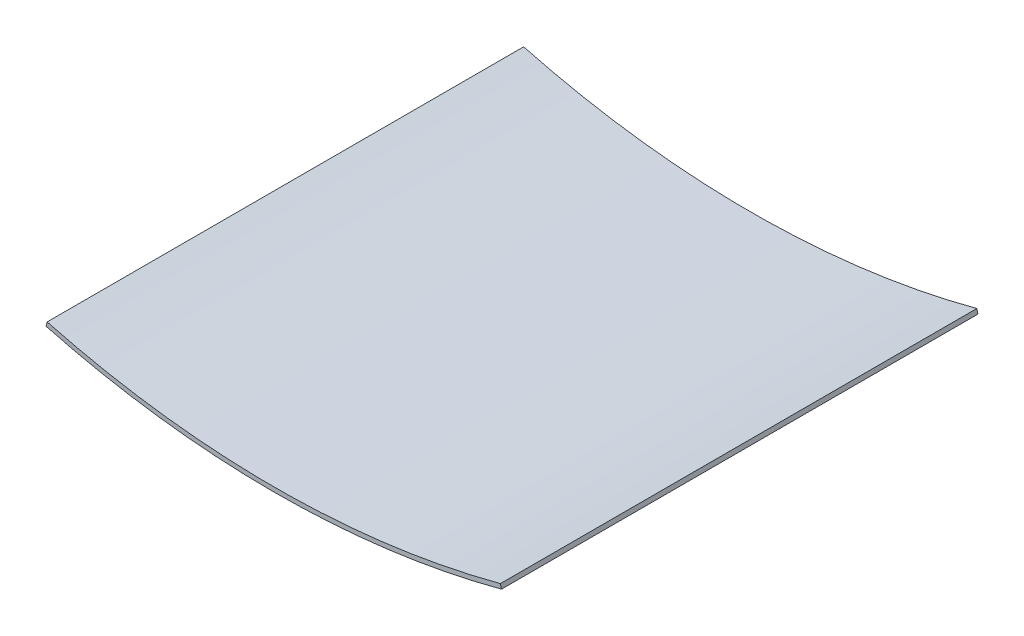
ISO-10303-21;
HEADER;
FILE_DESCRIPTION(('STEP AP214'),'2;1');
FILE_NAME('part.step','',(''),(''),'','','');
FILE_SCHEMA(('AUTOMOTIVE_DESIGN { 1 0 10303 214 1 1 1 1 }'));
ENDSEC;
DATA;
#1=APPLICATION_CONTEXT('core data for automotive mechanical design processes');
#2=APPLICATION_PROTOCOL_DEFINITION('international standard','automotive_design',2000,#1);
#3=PRODUCT_CONTEXT('',#1,'mechanical');
#4=PRODUCT('Part','Part','',(#3));
#5=PRODUCT_RELATED_PRODUCT_CATEGORY('part','',(#4));
#6=PRODUCT_DEFINITION_FORMATION('','',#4);
#7=PRODUCT_DEFINITION_CONTEXT('part definition',#1,'design');
#8=PRODUCT_DEFINITION('design','',#6,#7);
#9=PRODUCT_DEFINITION_SHAPE('','',#8);
#10=(LENGTH_UNIT() NAMED_UNIT(*) SI_UNIT(.MILLI.,.METRE.));
#11=(NAMED_UNIT(*) PLANE_ANGLE_UNIT() SI_UNIT($,.RADIAN.));
#12=(NAMED_UNIT(*) SI_UNIT($,.STERADIAN.) SOLID_ANGLE_UNIT());
#13=UNCERTAINTY_MEASURE_WITH_UNIT(LENGTH_MEASURE(1.E-05),#10,'distance_accuracy_value','');
#14=(GEOMETRIC_REPRESENTATION_CONTEXT(3) GLOBAL_UNCERTAINTY_ASSIGNED_CONTEXT((#13)) GLOBAL_UNIT_ASSIGNED_CONTEXT((#10,
#11,#12)) REPRESENTATION_CONTEXT('',''));
#15=CARTESIAN_POINT('',(0.,0.,0.));
#16=DIRECTION('',(0.,0.,1.));
#17=DIRECTION('',(1.,0.,0.));
#18=AXIS2_PLACEMENT_3D('',#15,#16,#17);
#19=CARTESIAN_POINT('',(0.,761.223622047244,410.));
#20=DIRECTION('',(0.,0.,-1.));
#21=DIRECTION('',(-1.,0.,0.));
#22=AXIS2_PLACEMENT_3D('',#19,#20,#21);
#23=CYLINDRICAL_SURFACE('',#22,765.033622047244);
#24=CARTESIAN_POINT('',(0.,761.223622047244,0.));
#25=DIRECTION('',(0.,0.,1.));
#26=DIRECTION('',(1.,0.,0.));
#27=AXIS2_PLACEMENT_3D('',#24,#25,#26);
#28=CIRCLE('',#27,765.033622047244);
#29=CARTESIAN_POINT('',(-195.97599441016,21.717129528298,0.));
#30=VERTEX_POINT('',#29);
#31=CARTESIAN_POINT('',(195.97599441016,21.7171295282979,0.));
#32=VERTEX_POINT('',#31);
#33=EDGE_CURVE('E96',#30,#32,#28,.T.);
#34=ORIENTED_EDGE('',*,*,#33,.T.);
#35=DIRECTION('',(0.,0.,-1.));
#36=VECTOR('',#35,1.);
#37=CARTESIAN_POINT('',(195.97599441016,21.7171295282979,410.));
#38=LINE('',#37,#36);
#39=CARTESIAN_POINT('',(195.97599441016,21.7171295282979,410.));
#40=VERTEX_POINT('',#39);
#41=EDGE_CURVE('E11',#40,#32,#38,.T.);
#42=ORIENTED_EDGE('',*,*,#41,.F.);
#43=CARTESIAN_POINT('',(0.,761.223622047244,410.));
#44=DIRECTION('',(0.,0.,1.));
#45=DIRECTION('',(1.,0.,0.));
#46=AXIS2_PLACEMENT_3D('',#43,#44,#45);
#47=CIRCLE('',#46,765.033622047244);
#48=CARTESIAN_POINT('',(-195.97599441016,21.717129528298,410.));
#49=VERTEX_POINT('',#48);
#50=EDGE_CURVE('E73',#49,#40,#47,.T.);
#51=ORIENTED_EDGE('',*,*,#50,.F.);
#52=DIRECTION('',(0.,0.,-1.));
#53=VECTOR('',#52,1.);
#54=CARTESIAN_POINT('',(-195.97599441016,21.717129528298,410.));
#55=LINE('',#54,#53);
#56=EDGE_CURVE('E49',#49,#30,#55,.T.);
#57=ORIENTED_EDGE('',*,*,#56,.T.);
#58=EDGE_LOOP('',(#34,#42,#51,#57));
#59=FACE_BOUND('',#58,.T.);
#60=ADVANCED_FACE('F33',(#59),#23,.T.);
#61=CARTESIAN_POINT('',(195.,25.4,410.));
#62=DIRECTION('',(0.966632669738111,0.256166511853074,0.));
#63=DIRECTION('',(-0.256166511853074,0.966632669738112,0.));
#64=AXIS2_PLACEMENT_3D('',#61,#62,#63);
#65=PLANE('',#64);
#66=DIRECTION('',(0.256166511853074,-0.966632669738111,0.));
#67=VECTOR('',#66,1.);
#68=CARTESIAN_POINT('',(195.,25.4,0.));
#69=LINE('',#68,#67);
#70=CARTESIAN_POINT('',(195.,25.4,0.));
#71=VERTEX_POINT('',#70);
#72=EDGE_CURVE('E82',#71,#32,#69,.T.);
#73=ORIENTED_EDGE('',*,*,#72,.F.);
#74=DIRECTION('',(0.,0.,-1.));
#75=VECTOR('',#74,1.);
#76=CARTESIAN_POINT('',(195.,25.4,410.));
#77=LINE('',#76,#75);
#78=CARTESIAN_POINT('',(195.,25.4,410.));
#79=VERTEX_POINT('',#78);
#80=EDGE_CURVE('E41',#79,#71,#77,.T.);
#81=ORIENTED_EDGE('',*,*,#80,.F.);
#82=DIRECTION('',(0.256166511853074,-0.966632669738111,0.));
#83=VECTOR('',#82,1.);
#84=CARTESIAN_POINT('',(195.,25.4,410.));
#85=LINE('',#84,#83);
#86=EDGE_CURVE('E80',#79,#40,#85,.T.);
#87=ORIENTED_EDGE('',*,*,#86,.T.);
#88=ORIENTED_EDGE('',*,*,#41,.T.);
#89=EDGE_LOOP('',(#73,#81,#87,#88));
#90=FACE_BOUND('',#89,.T.);
#91=ADVANCED_FACE('F79',(#90),#65,.T.);
#92=CARTESIAN_POINT('',(0.,761.223622047244,410.));
#93=DIRECTION('',(0.,0.,-1.));
#94=DIRECTION('',(-1.,0.,0.));
#95=AXIS2_PLACEMENT_3D('',#92,#93,#94);
#96=CYLINDRICAL_SURFACE('',#95,761.223622047244);
#97=CARTESIAN_POINT('',(0.,761.223622047244,0.));
#98=DIRECTION('',(0.,0.,1.));
#99=DIRECTION('',(1.,0.,0.));
#100=AXIS2_PLACEMENT_3D('',#97,#98,#99);
#101=CIRCLE('',#100,761.223622047244);
#102=CARTESIAN_POINT('',(-195.,25.4000000000001,0.));
#103=VERTEX_POINT('',#102);
#104=EDGE_CURVE('E99',#103,#71,#101,.T.);
#105=ORIENTED_EDGE('',*,*,#104,.F.);
#106=DIRECTION('',(0.,0.,-1.));
#107=VECTOR('',#106,1.);
#108=CARTESIAN_POINT('',(-195.,25.4000000000001,410.));
#109=LINE('',#108,#107);
#110=CARTESIAN_POINT('',(-195.,25.4000000000001,410.));
#111=VERTEX_POINT('',#110);
#112=EDGE_CURVE('E62',#111,#103,#109,.T.);
#113=ORIENTED_EDGE('',*,*,#112,.F.);
#114=CARTESIAN_POINT('',(0.,761.223622047244,410.));
#115=DIRECTION('',(0.,0.,1.));
#116=DIRECTION('',(1.,0.,0.));
#117=AXIS2_PLACEMENT_3D('',#114,#115,#116);
#118=CIRCLE('',#117,761.223622047244);
#119=EDGE_CURVE('E88',#111,#79,#118,.T.);
#120=ORIENTED_EDGE('',*,*,#119,.T.);
#121=ORIENTED_EDGE('',*,*,#80,.T.);
#122=EDGE_LOOP('',(#105,#113,#120,#121));
#123=FACE_BOUND('',#122,.T.);
#124=ADVANCED_FACE('F90',(#123),#96,.F.);
#125=CARTESIAN_POINT('',(-195.97599441016,21.717129528298,410.));
#126=DIRECTION('',(-0.966632669738111,0.256166511853074,0.));
#127=DIRECTION('',(-0.256166511853074,-0.966632669738112,0.));
#128=AXIS2_PLACEMENT_3D('',#125,#126,#127);
#129=PLANE('',#128);
#130=DIRECTION('',(0.256166511853074,0.966632669738111,0.));
#131=VECTOR('',#130,1.);
#132=CARTESIAN_POINT('',(-195.97599441016,21.717129528298,0.));
#133=LINE('',#132,#131);
#134=EDGE_CURVE('E101',#30,#103,#133,.T.);
#135=ORIENTED_EDGE('',*,*,#134,.F.);
#136=ORIENTED_EDGE('',*,*,#56,.F.);
#137=DIRECTION('',(0.256166511853074,0.966632669738111,0.));
#138=VECTOR('',#137,1.);
#139=CARTESIAN_POINT('',(-195.97599441016,21.717129528298,410.));
#140=LINE('',#139,#138);
#141=EDGE_CURVE('E91',#49,#111,#140,.T.);
#142=ORIENTED_EDGE('',*,*,#141,.T.);
#143=ORIENTED_EDGE('',*,*,#112,.T.);
#144=EDGE_LOOP('',(#135,#136,#142,#143));
#145=FACE_BOUND('',#144,.T.);
#146=ADVANCED_FACE('F107',(#145),#129,.T.);
#147=CARTESIAN_POINT('',(0.,761.223622047244,410.));
#148=DIRECTION('',(0.,0.,1.));
#149=DIRECTION('',(1.,0.,0.));
#150=AXIS2_PLACEMENT_3D('',#147,#148,#149);
#151=PLANE('',#150);
#152=ORIENTED_EDGE('',*,*,#50,.T.);
#153=ORIENTED_EDGE('',*,*,#86,.F.);
#154=ORIENTED_EDGE('',*,*,#119,.F.);
#155=ORIENTED_EDGE('',*,*,#141,.F.);
#156=EDGE_LOOP('',(#152,#153,#154,#155));
#157=FACE_BOUND('',#156,.T.);
#158=ADVANCED_FACE('F87',(#157),#151,.T.);
#159=CARTESIAN_POINT('',(0.,761.223622047244,0.));
#160=DIRECTION('',(0.,0.,1.));
#161=DIRECTION('',(1.,0.,0.));
#162=AXIS2_PLACEMENT_3D('',#159,#160,#161);
#163=PLANE('',#162);
#164=ORIENTED_EDGE('',*,*,#33,.F.);
#165=ORIENTED_EDGE('',*,*,#134,.T.);
#166=ORIENTED_EDGE('',*,*,#104,.T.);
#167=ORIENTED_EDGE('',*,*,#72,.T.);
#168=EDGE_LOOP('',(#164,#165,#166,#167));
#169=FACE_BOUND('',#168,.T.);
#170=ADVANCED_FACE('F106',(#169),#163,.F.);
#171=CLOSED_SHELL('',(#60,#91,#124,#146,#158,#170));
#172=MANIFOLD_SOLID_BREP('B2',#171);
#173=ADVANCED_BREP_SHAPE_REPRESENTATION('',(#18,#172),#14);
#174=SHAPE_DEFINITION_REPRESENTATION(#9,#173);
ENDSEC;
END-ISO-10303-21;
